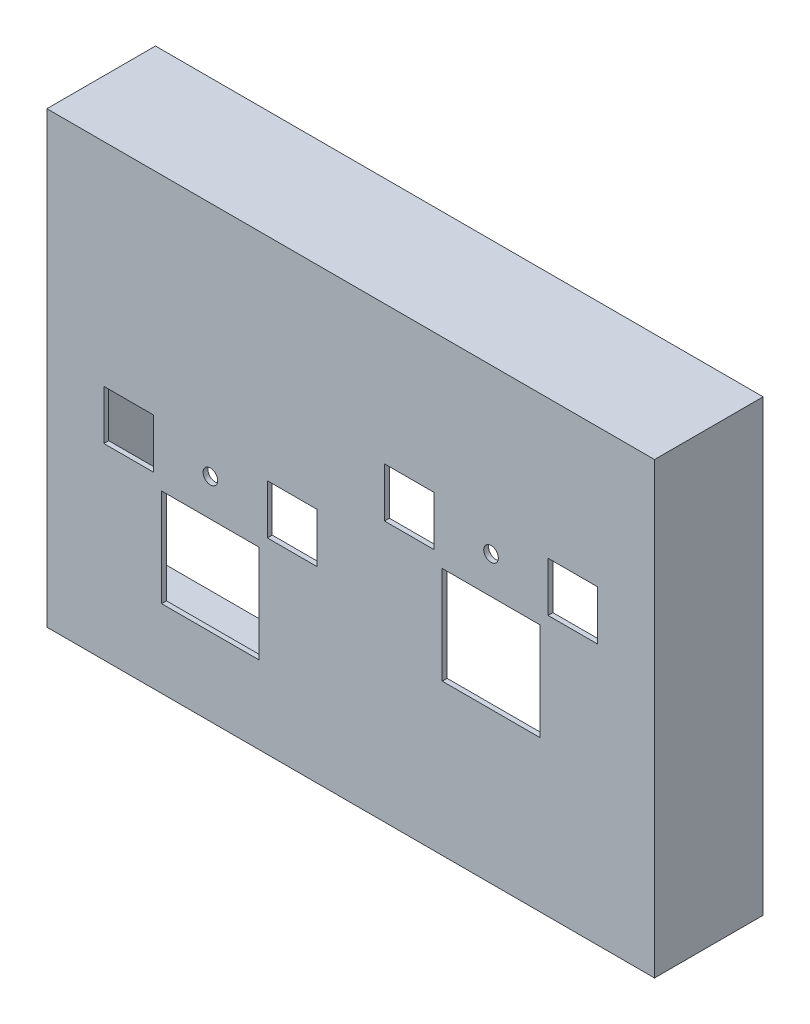
ISO-10303-21;
HEADER;
FILE_DESCRIPTION(('STEP AP214'),'2;1');
FILE_NAME('part.step','',(''),(''),'','','');
FILE_SCHEMA(('AUTOMOTIVE_DESIGN { 1 0 10303 214 1 1 1 1 }'));
ENDSEC;
DATA;
#1=APPLICATION_CONTEXT('core data for automotive mechanical design processes');
#2=APPLICATION_PROTOCOL_DEFINITION('international standard','automotive_design',2000,#1);
#3=PRODUCT_CONTEXT('',#1,'mechanical');
#4=PRODUCT('Part','Part','',(#3));
#5=PRODUCT_RELATED_PRODUCT_CATEGORY('part','',(#4));
#6=PRODUCT_DEFINITION_FORMATION('','',#4);
#7=PRODUCT_DEFINITION_CONTEXT('part definition',#1,'design');
#8=PRODUCT_DEFINITION('design','',#6,#7);
#9=PRODUCT_DEFINITION_SHAPE('','',#8);
#10=(LENGTH_UNIT() NAMED_UNIT(*) SI_UNIT(.MILLI.,.METRE.));
#11=(NAMED_UNIT(*) PLANE_ANGLE_UNIT() SI_UNIT($,.RADIAN.));
#12=(NAMED_UNIT(*) SI_UNIT($,.STERADIAN.) SOLID_ANGLE_UNIT());
#13=UNCERTAINTY_MEASURE_WITH_UNIT(LENGTH_MEASURE(1.E-05),#10,'distance_accuracy_value','');
#14=(GEOMETRIC_REPRESENTATION_CONTEXT(3) GLOBAL_UNCERTAINTY_ASSIGNED_CONTEXT((#13)) GLOBAL_UNIT_ASSIGNED_CONTEXT((#10,
#11,#12)) REPRESENTATION_CONTEXT('',''));
#15=CARTESIAN_POINT('',(0.,0.,0.));
#16=DIRECTION('',(0.,0.,1.));
#17=DIRECTION('',(1.,0.,0.));
#18=AXIS2_PLACEMENT_3D('',#15,#16,#17);
#19=CARTESIAN_POINT('',(0.,0.,0.));
#20=DIRECTION('',(0.,0.,-1.));
#21=DIRECTION('',(-1.,0.,0.));
#22=AXIS2_PLACEMENT_3D('',#19,#20,#21);
#23=PLANE('',#22);
#24=DIRECTION('',(-1.,0.,0.));
#25=VECTOR('',#24,1.);
#26=CARTESIAN_POINT('',(247.,-58.,0.));
#27=LINE('',#26,#25);
#28=CARTESIAN_POINT('',(247.,-58.,0.));
#29=VERTEX_POINT('',#28);
#30=CARTESIAN_POINT('',(2.00000000000001,-58.,0.));
#31=VERTEX_POINT('',#30);
#32=EDGE_CURVE('E290',#29,#31,#27,.T.);
#33=ORIENTED_EDGE('',*,*,#32,.F.);
#34=DIRECTION('',(0.,1.,0.));
#35=VECTOR('',#34,1.);
#36=CARTESIAN_POINT('',(247.,0.,0.));
#37=LINE('',#36,#35);
#38=CARTESIAN_POINT('',(247.,122.,0.));
#39=VERTEX_POINT('',#38);
#40=EDGE_CURVE('E509',#29,#39,#37,.T.);
#41=ORIENTED_EDGE('',*,*,#40,.T.);
#42=DIRECTION('',(1.,0.,0.));
#43=VECTOR('',#42,1.);
#44=CARTESIAN_POINT('',(2.,122.,0.));
#45=LINE('',#44,#43);
#46=CARTESIAN_POINT('',(2.,122.,0.));
#47=VERTEX_POINT('',#46);
#48=EDGE_CURVE('E325',#47,#39,#45,.T.);
#49=ORIENTED_EDGE('',*,*,#48,.F.);
#50=DIRECTION('',(0.,-1.,0.));
#51=VECTOR('',#50,1.);
#52=CARTESIAN_POINT('',(2.,0.,0.));
#53=LINE('',#52,#51);
#54=EDGE_CURVE('E505',#47,#31,#53,.T.);
#55=ORIENTED_EDGE('',*,*,#54,.T.);
#56=EDGE_LOOP('',(#33,#41,#49,#55));
#57=FACE_BOUND('',#56,.T.);
#58=DIRECTION('',(0.,-1.,0.));
#59=VECTOR('',#58,1.);
#60=CARTESIAN_POINT('',(0.,0.,0.));
#61=LINE('',#60,#59);
#62=CARTESIAN_POINT('',(0.,124.,0.));
#63=VERTEX_POINT('',#62);
#64=CARTESIAN_POINT('',(0.,-60.,0.));
#65=VERTEX_POINT('',#64);
#66=EDGE_CURVE('E511',#63,#65,#61,.T.);
#67=ORIENTED_EDGE('',*,*,#66,.F.);
#68=DIRECTION('',(-1.,0.,0.));
#69=VECTOR('',#68,1.);
#70=CARTESIAN_POINT('',(0.,124.,0.));
#71=LINE('',#70,#69);
#72=CARTESIAN_POINT('',(249.,124.,0.));
#73=VERTEX_POINT('',#72);
#74=EDGE_CURVE('E362',#73,#63,#71,.T.);
#75=ORIENTED_EDGE('',*,*,#74,.F.);
#76=DIRECTION('',(0.,1.,0.));
#77=VECTOR('',#76,1.);
#78=CARTESIAN_POINT('',(249.,0.,0.));
#79=LINE('',#78,#77);
#80=CARTESIAN_POINT('',(249.,-60.,0.));
#81=VERTEX_POINT('',#80);
#82=EDGE_CURVE('E514',#81,#73,#79,.T.);
#83=ORIENTED_EDGE('',*,*,#82,.F.);
#84=DIRECTION('',(1.,0.,0.));
#85=VECTOR('',#84,1.);
#86=CARTESIAN_POINT('',(0.,-60.,0.));
#87=LINE('',#86,#85);
#88=EDGE_CURVE('E349',#65,#81,#87,.T.);
#89=ORIENTED_EDGE('',*,*,#88,.F.);
#90=EDGE_LOOP('',(#67,#75,#83,#89));
#91=FACE_BOUND('',#90,.T.);
#92=ADVANCED_FACE('F43',(#57,#91),#23,.T.);
#93=CARTESIAN_POINT('',(0.,0.,44.5));
#94=DIRECTION('',(1.,0.,0.));
#95=DIRECTION('',(0.,0.,-1.));
#96=AXIS2_PLACEMENT_3D('',#93,#94,#95);
#97=PLANE('',#96);
#98=ORIENTED_EDGE('',*,*,#66,.T.);
#99=DIRECTION('',(0.,0.,1.));
#100=VECTOR('',#99,1.);
#101=CARTESIAN_POINT('',(0.,-60.,-256.126921661898));
#102=LINE('',#101,#100);
#103=CARTESIAN_POINT('',(0.,-60.,44.5));
#104=VERTEX_POINT('',#103);
#105=EDGE_CURVE('E355',#65,#104,#102,.T.);
#106=ORIENTED_EDGE('',*,*,#105,.T.);
#107=DIRECTION('',(0.,-1.,0.));
#108=VECTOR('',#107,1.);
#109=CARTESIAN_POINT('',(0.,0.,44.5));
#110=LINE('',#109,#108);
#111=CARTESIAN_POINT('',(0.,124.,44.5));
#112=VERTEX_POINT('',#111);
#113=EDGE_CURVE('E52',#112,#104,#110,.T.);
#114=ORIENTED_EDGE('',*,*,#113,.F.);
#115=DIRECTION('',(0.,0.,1.));
#116=VECTOR('',#115,1.);
#117=CARTESIAN_POINT('',(0.,124.,-256.126921661898));
#118=LINE('',#117,#116);
#119=EDGE_CURVE('E365',#63,#112,#118,.T.);
#120=ORIENTED_EDGE('',*,*,#119,.F.);
#121=EDGE_LOOP('',(#98,#106,#114,#120));
#122=FACE_BOUND('',#121,.T.);
#123=ADVANCED_FACE('F45',(#122),#97,.F.);
#124=CARTESIAN_POINT('',(249.,0.,44.5));
#125=DIRECTION('',(-1.,0.,0.));
#126=DIRECTION('',(0.,0.,1.));
#127=AXIS2_PLACEMENT_3D('',#124,#125,#126);
#128=PLANE('',#127);
#129=ORIENTED_EDGE('',*,*,#82,.T.);
#130=DIRECTION('',(0.,0.,1.));
#131=VECTOR('',#130,1.);
#132=CARTESIAN_POINT('',(249.,124.,-256.126921661898));
#133=LINE('',#132,#131);
#134=CARTESIAN_POINT('',(249.,124.,44.5));
#135=VERTEX_POINT('',#134);
#136=EDGE_CURVE('E361',#73,#135,#133,.T.);
#137=ORIENTED_EDGE('',*,*,#136,.T.);
#138=DIRECTION('',(0.,1.,0.));
#139=VECTOR('',#138,1.);
#140=CARTESIAN_POINT('',(249.,0.,44.5));
#141=LINE('',#140,#139);
#142=CARTESIAN_POINT('',(249.,-60.,44.5));
#143=VERTEX_POINT('',#142);
#144=EDGE_CURVE('E12',#143,#135,#141,.T.);
#145=ORIENTED_EDGE('',*,*,#144,.F.);
#146=DIRECTION('',(0.,0.,1.));
#147=VECTOR('',#146,1.);
#148=CARTESIAN_POINT('',(249.,-60.,-256.126921661898));
#149=LINE('',#148,#147);
#150=EDGE_CURVE('E352',#81,#143,#149,.T.);
#151=ORIENTED_EDGE('',*,*,#150,.F.);
#152=EDGE_LOOP('',(#129,#137,#145,#151));
#153=FACE_BOUND('',#152,.T.);
#154=ADVANCED_FACE('F577',(#153),#128,.F.);
#155=CARTESIAN_POINT('',(0.,0.,44.5));
#156=DIRECTION('',(0.,0.,-1.));
#157=DIRECTION('',(-1.,0.,0.));
#158=AXIS2_PLACEMENT_3D('',#155,#156,#157);
#159=PLANE('',#158);
#160=DIRECTION('',(1.,0.,0.));
#161=VECTOR('',#160,1.);
#162=CARTESIAN_POINT('',(47.,-28.15,44.5));
#163=LINE('',#162,#161);
#164=CARTESIAN_POINT('',(47.,-28.15,44.5));
#165=VERTEX_POINT('',#164);
#166=CARTESIAN_POINT('',(87.,-28.15,44.5));
#167=VERTEX_POINT('',#166);
#168=EDGE_CURVE('E283',#165,#167,#163,.T.);
#169=ORIENTED_EDGE('',*,*,#168,.F.);
#170=DIRECTION('',(0.,-1.,0.));
#171=VECTOR('',#170,1.);
#172=CARTESIAN_POINT('',(47.,11.85,44.5));
#173=LINE('',#172,#171);
#174=CARTESIAN_POINT('',(47.,11.85,44.5));
#175=VERTEX_POINT('',#174);
#176=EDGE_CURVE('E60',#175,#165,#173,.T.);
#177=ORIENTED_EDGE('',*,*,#176,.F.);
#178=DIRECTION('',(-1.,0.,0.));
#179=VECTOR('',#178,1.);
#180=CARTESIAN_POINT('',(47.,11.85,44.5));
#181=LINE('',#180,#179);
#182=CARTESIAN_POINT('',(87.,11.85,44.5));
#183=VERTEX_POINT('',#182);
#184=EDGE_CURVE('E274',#183,#175,#181,.T.);
#185=ORIENTED_EDGE('',*,*,#184,.F.);
#186=DIRECTION('',(0.,1.,0.));
#187=VECTOR('',#186,1.);
#188=CARTESIAN_POINT('',(87.,11.85,44.5));
#189=LINE('',#188,#187);
#190=EDGE_CURVE('E277',#167,#183,#189,.T.);
#191=ORIENTED_EDGE('',*,*,#190,.F.);
#192=EDGE_LOOP('',(#169,#177,#185,#191));
#193=FACE_BOUND('',#192,.T.);
#194=DIRECTION('',(1.,0.,0.));
#195=VECTOR('',#194,1.);
#196=CARTESIAN_POINT('',(162.,1.85,44.5));
#197=LINE('',#196,#195);
#198=CARTESIAN_POINT('',(162.,1.85,44.5));
#199=VERTEX_POINT('',#198);
#200=CARTESIAN_POINT('',(202.,1.85,44.5));
#201=VERTEX_POINT('',#200);
#202=EDGE_CURVE('E309',#199,#201,#197,.T.);
#203=ORIENTED_EDGE('',*,*,#202,.F.);
#204=DIRECTION('',(0.,-1.,0.));
#205=VECTOR('',#204,1.);
#206=CARTESIAN_POINT('',(162.,41.85,44.5));
#207=LINE('',#206,#205);
#208=CARTESIAN_POINT('',(162.,41.85,44.5));
#209=VERTEX_POINT('',#208);
#210=EDGE_CURVE('E68',#209,#199,#207,.T.);
#211=ORIENTED_EDGE('',*,*,#210,.F.);
#212=DIRECTION('',(-1.,0.,0.));
#213=VECTOR('',#212,1.);
#214=CARTESIAN_POINT('',(162.,41.85,44.5));
#215=LINE('',#214,#213);
#216=CARTESIAN_POINT('',(202.,41.85,44.5));
#217=VERTEX_POINT('',#216);
#218=EDGE_CURVE('E298',#217,#209,#215,.T.);
#219=ORIENTED_EDGE('',*,*,#218,.F.);
#220=DIRECTION('',(0.,1.,0.));
#221=VECTOR('',#220,1.);
#222=CARTESIAN_POINT('',(202.,41.85,44.5));
#223=LINE('',#222,#221);
#224=EDGE_CURVE('E312',#201,#217,#223,.T.);
#225=ORIENTED_EDGE('',*,*,#224,.F.);
#226=EDGE_LOOP('',(#203,#211,#219,#225));
#227=FACE_BOUND('',#226,.T.);
#228=CARTESIAN_POINT('',(67.,27.,44.5));
#229=DIRECTION('',(0.,0.,1.));
#230=DIRECTION('',(1.,0.,0.));
#231=AXIS2_PLACEMENT_3D('',#228,#229,#230);
#232=CIRCLE('',#231,3.00000000000001);
#233=CARTESIAN_POINT('',(70.,27.,44.5));
#234=VERTEX_POINT('',#233);
#235=EDGE_CURVE('E371',#234,#234,#232,.T.);
#236=ORIENTED_EDGE('',*,*,#235,.F.);
#237=EDGE_LOOP('',(#236));
#238=FACE_BOUND('',#237,.T.);
#239=CARTESIAN_POINT('',(182.,57.,44.5));
#240=DIRECTION('',(0.,0.,1.));
#241=DIRECTION('',(1.,0.,0.));
#242=AXIS2_PLACEMENT_3D('',#239,#240,#241);
#243=CIRCLE('',#242,2.99999999999999);
#244=CARTESIAN_POINT('',(185.,57.,44.5));
#245=VERTEX_POINT('',#244);
#246=EDGE_CURVE('E368',#245,#245,#243,.T.);
#247=ORIENTED_EDGE('',*,*,#246,.F.);
#248=EDGE_LOOP('',(#247));
#249=FACE_BOUND('',#248,.T.);
#250=DIRECTION('',(1.,0.,0.));
#251=VECTOR('',#250,1.);
#252=CARTESIAN_POINT('',(0.,37.15,44.5));
#253=LINE('',#252,#251);
#254=CARTESIAN_POINT('',(23.35,37.15,44.5));
#255=VERTEX_POINT('',#254);
#256=CARTESIAN_POINT('',(43.65,37.15,44.5));
#257=VERTEX_POINT('',#256);
#258=EDGE_CURVE('E499',#255,#257,#253,.T.);
#259=ORIENTED_EDGE('',*,*,#258,.T.);
#260=DIRECTION('',(0.,-1.,0.));
#261=VECTOR('',#260,1.);
#262=CARTESIAN_POINT('',(43.65,0.,44.5));
#263=LINE('',#262,#261);
#264=CARTESIAN_POINT('',(43.65,16.85,44.5));
#265=VERTEX_POINT('',#264);
#266=EDGE_CURVE('E502',#257,#265,#263,.T.);
#267=ORIENTED_EDGE('',*,*,#266,.T.);
#268=DIRECTION('',(-1.,0.,0.));
#269=VECTOR('',#268,1.);
#270=CARTESIAN_POINT('',(0.,16.85,44.5));
#271=LINE('',#270,#269);
#272=CARTESIAN_POINT('',(23.35,16.85,44.5));
#273=VERTEX_POINT('',#272);
#274=EDGE_CURVE('E493',#265,#273,#271,.T.);
#275=ORIENTED_EDGE('',*,*,#274,.T.);
#276=DIRECTION('',(0.,1.,0.));
#277=VECTOR('',#276,1.);
#278=CARTESIAN_POINT('',(23.35,0.,44.5));
#279=LINE('',#278,#277);
#280=EDGE_CURVE('E496',#273,#255,#279,.T.);
#281=ORIENTED_EDGE('',*,*,#280,.T.);
#282=EDGE_LOOP('',(#259,#267,#275,#281));
#283=FACE_BOUND('',#282,.T.);
#284=DIRECTION('',(1.,0.,0.));
#285=VECTOR('',#284,1.);
#286=CARTESIAN_POINT('',(0.,67.15,44.5));
#287=LINE('',#286,#285);
#288=CARTESIAN_POINT('',(205.35,67.15,44.5));
#289=VERTEX_POINT('',#288);
#290=CARTESIAN_POINT('',(225.65,67.15,44.5));
#291=VERTEX_POINT('',#290);
#292=EDGE_CURVE('E487',#289,#291,#287,.T.);
#293=ORIENTED_EDGE('',*,*,#292,.T.);
#294=DIRECTION('',(0.,-1.,0.));
#295=VECTOR('',#294,1.);
#296=CARTESIAN_POINT('',(225.65,0.,44.5));
#297=LINE('',#296,#295);
#298=CARTESIAN_POINT('',(225.65,46.85,44.5));
#299=VERTEX_POINT('',#298);
#300=EDGE_CURVE('E490',#291,#299,#297,.T.);
#301=ORIENTED_EDGE('',*,*,#300,.T.);
#302=DIRECTION('',(-1.,0.,0.));
#303=VECTOR('',#302,1.);
#304=CARTESIAN_POINT('',(0.,46.85,44.5));
#305=LINE('',#304,#303);
#306=CARTESIAN_POINT('',(205.35,46.85,44.5));
#307=VERTEX_POINT('',#306);
#308=EDGE_CURVE('E481',#299,#307,#305,.T.);
#309=ORIENTED_EDGE('',*,*,#308,.T.);
#310=DIRECTION('',(0.,1.,0.));
#311=VECTOR('',#310,1.);
#312=CARTESIAN_POINT('',(205.35,0.,44.5));
#313=LINE('',#312,#311);
#314=EDGE_CURVE('E484',#307,#289,#313,.T.);
#315=ORIENTED_EDGE('',*,*,#314,.T.);
#316=EDGE_LOOP('',(#293,#301,#309,#315));
#317=FACE_BOUND('',#316,.T.);
#318=DIRECTION('',(1.,0.,0.));
#319=VECTOR('',#318,1.);
#320=CARTESIAN_POINT('',(0.,67.15,44.5));
#321=LINE('',#320,#319);
#322=CARTESIAN_POINT('',(138.35,67.15,44.5));
#323=VERTEX_POINT('',#322);
#324=CARTESIAN_POINT('',(158.65,67.15,44.5));
#325=VERTEX_POINT('',#324);
#326=EDGE_CURVE('E475',#323,#325,#321,.T.);
#327=ORIENTED_EDGE('',*,*,#326,.T.);
#328=DIRECTION('',(0.,-1.,0.));
#329=VECTOR('',#328,1.);
#330=CARTESIAN_POINT('',(158.65,2.16917343419681E-13,44.5));
#331=LINE('',#330,#329);
#332=CARTESIAN_POINT('',(158.65,46.85,44.5));
#333=VERTEX_POINT('',#332);
#334=EDGE_CURVE('E478',#325,#333,#331,.T.);
#335=ORIENTED_EDGE('',*,*,#334,.T.);
#336=DIRECTION('',(-1.,0.,0.));
#337=VECTOR('',#336,1.);
#338=CARTESIAN_POINT('',(0.,46.8499999999999,44.5));
#339=LINE('',#338,#337);
#340=CARTESIAN_POINT('',(138.35,46.85,44.5));
#341=VERTEX_POINT('',#340);
#342=EDGE_CURVE('E469',#333,#341,#339,.T.);
#343=ORIENTED_EDGE('',*,*,#342,.T.);
#344=DIRECTION('',(0.,1.,0.));
#345=VECTOR('',#344,1.);
#346=CARTESIAN_POINT('',(138.35,0.,44.5));
#347=LINE('',#346,#345);
#348=EDGE_CURVE('E472',#341,#323,#347,.T.);
#349=ORIENTED_EDGE('',*,*,#348,.T.);
#350=EDGE_LOOP('',(#327,#335,#343,#349));
#351=FACE_BOUND('',#350,.T.);
#352=DIRECTION('',(1.,0.,0.));
#353=VECTOR('',#352,1.);
#354=CARTESIAN_POINT('',(0.,37.15,44.5));
#355=LINE('',#354,#353);
#356=CARTESIAN_POINT('',(90.35,37.15,44.5));
#357=VERTEX_POINT('',#356);
#358=CARTESIAN_POINT('',(110.65,37.15,44.5));
#359=VERTEX_POINT('',#358);
#360=EDGE_CURVE('E463',#357,#359,#355,.T.);
#361=ORIENTED_EDGE('',*,*,#360,.T.);
#362=DIRECTION('',(0.,-1.,0.));
#363=VECTOR('',#362,1.);
#364=CARTESIAN_POINT('',(110.65,0.,44.5));
#365=LINE('',#364,#363);
#366=CARTESIAN_POINT('',(110.65,16.85,44.5));
#367=VERTEX_POINT('',#366);
#368=EDGE_CURVE('E466',#359,#367,#365,.T.);
#369=ORIENTED_EDGE('',*,*,#368,.T.);
#370=DIRECTION('',(-1.,0.,0.));
#371=VECTOR('',#370,1.);
#372=CARTESIAN_POINT('',(0.,16.85,44.5));
#373=LINE('',#372,#371);
#374=CARTESIAN_POINT('',(90.35,16.85,44.5));
#375=VERTEX_POINT('',#374);
#376=EDGE_CURVE('E451',#367,#375,#373,.T.);
#377=ORIENTED_EDGE('',*,*,#376,.T.);
#378=DIRECTION('',(0.,1.,0.));
#379=VECTOR('',#378,1.);
#380=CARTESIAN_POINT('',(90.35,0.,44.5));
#381=LINE('',#380,#379);
#382=EDGE_CURVE('E460',#375,#357,#381,.T.);
#383=ORIENTED_EDGE('',*,*,#382,.T.);
#384=EDGE_LOOP('',(#361,#369,#377,#383));
#385=FACE_BOUND('',#384,.T.);
#386=ORIENTED_EDGE('',*,*,#113,.T.);
#387=DIRECTION('',(1.,0.,0.));
#388=VECTOR('',#387,1.);
#389=CARTESIAN_POINT('',(0.,-60.,44.5));
#390=LINE('',#389,#388);
#391=EDGE_CURVE('E344',#104,#143,#390,.T.);
#392=ORIENTED_EDGE('',*,*,#391,.T.);
#393=ORIENTED_EDGE('',*,*,#144,.T.);
#394=DIRECTION('',(-1.,0.,0.));
#395=VECTOR('',#394,1.);
#396=CARTESIAN_POINT('',(0.,124.,44.5));
#397=LINE('',#396,#395);
#398=EDGE_CURVE('E358',#135,#112,#397,.T.);
#399=ORIENTED_EDGE('',*,*,#398,.T.);
#400=EDGE_LOOP('',(#386,#392,#393,#399));
#401=FACE_BOUND('',#400,.T.);
#402=ADVANCED_FACE('F583',(#193,#227,#238,#249,#283,#317,#351,#385,#401),#159,.F.);
#403=CARTESIAN_POINT('',(2.,0.,44.5));
#404=DIRECTION('',(1.,0.,0.));
#405=DIRECTION('',(0.,0.,-1.));
#406=AXIS2_PLACEMENT_3D('',#403,#404,#405);
#407=PLANE('',#406);
#408=DIRECTION('',(0.,0.,-1.));
#409=VECTOR('',#408,1.);
#410=CARTESIAN_POINT('',(2.00000000000001,-58.,42.5));
#411=LINE('',#410,#409);
#412=CARTESIAN_POINT('',(2.00000000000001,-58.,42.5));
#413=VERTEX_POINT('',#412);
#414=EDGE_CURVE('E333',#413,#31,#411,.T.);
#415=ORIENTED_EDGE('',*,*,#414,.T.);
#416=ORIENTED_EDGE('',*,*,#54,.F.);
#417=DIRECTION('',(0.,0.,-1.));
#418=VECTOR('',#417,1.);
#419=CARTESIAN_POINT('',(2.00000000000001,122.,42.5));
#420=LINE('',#419,#418);
#421=CARTESIAN_POINT('',(2.00000000000001,122.,42.5));
#422=VERTEX_POINT('',#421);
#423=EDGE_CURVE('E332',#422,#47,#420,.T.);
#424=ORIENTED_EDGE('',*,*,#423,.F.);
#425=DIRECTION('',(0.,-1.,0.));
#426=VECTOR('',#425,1.);
#427=CARTESIAN_POINT('',(2.,0.,42.5));
#428=LINE('',#427,#426);
#429=EDGE_CURVE('E506',#422,#413,#428,.T.);
#430=ORIENTED_EDGE('',*,*,#429,.T.);
#431=EDGE_LOOP('',(#415,#416,#424,#430));
#432=FACE_BOUND('',#431,.T.);
#433=ADVANCED_FACE('F553',(#432),#407,.T.);
#434=CARTESIAN_POINT('',(247.,0.,44.5));
#435=DIRECTION('',(-1.,0.,0.));
#436=DIRECTION('',(0.,0.,1.));
#437=AXIS2_PLACEMENT_3D('',#434,#435,#436);
#438=PLANE('',#437);
#439=ORIENTED_EDGE('',*,*,#40,.F.);
#440=DIRECTION('',(0.,0.,1.));
#441=VECTOR('',#440,1.);
#442=CARTESIAN_POINT('',(247.,-58.,2.));
#443=LINE('',#442,#441);
#444=CARTESIAN_POINT('',(247.,-58.,42.5));
#445=VERTEX_POINT('',#444);
#446=EDGE_CURVE('E329',#29,#445,#443,.T.);
#447=ORIENTED_EDGE('',*,*,#446,.T.);
#448=DIRECTION('',(0.,1.,0.));
#449=VECTOR('',#448,1.);
#450=CARTESIAN_POINT('',(247.,0.,42.5));
#451=LINE('',#450,#449);
#452=CARTESIAN_POINT('',(247.,122.,42.5));
#453=VERTEX_POINT('',#452);
#454=EDGE_CURVE('E508',#445,#453,#451,.T.);
#455=ORIENTED_EDGE('',*,*,#454,.T.);
#456=DIRECTION('',(0.,0.,1.));
#457=VECTOR('',#456,1.);
#458=CARTESIAN_POINT('',(247.,122.,2.));
#459=LINE('',#458,#457);
#460=EDGE_CURVE('E340',#39,#453,#459,.T.);
#461=ORIENTED_EDGE('',*,*,#460,.F.);
#462=EDGE_LOOP('',(#439,#447,#455,#461));
#463=FACE_BOUND('',#462,.T.);
#464=ADVANCED_FACE('F529',(#463),#438,.T.);
#465=CARTESIAN_POINT('',(0.,0.,42.5));
#466=DIRECTION('',(0.,0.,-1.));
#467=DIRECTION('',(-1.,0.,0.));
#468=AXIS2_PLACEMENT_3D('',#465,#466,#467);
#469=PLANE('',#468);
#470=DIRECTION('',(0.,-1.,0.));
#471=VECTOR('',#470,1.);
#472=CARTESIAN_POINT('',(47.,11.85,42.5));
#473=LINE('',#472,#471);
#474=CARTESIAN_POINT('',(47.,11.85,42.5));
#475=VERTEX_POINT('',#474);
#476=CARTESIAN_POINT('',(47.,-28.15,42.5));
#477=VERTEX_POINT('',#476);
#478=EDGE_CURVE('E255',#475,#477,#473,.T.);
#479=ORIENTED_EDGE('',*,*,#478,.T.);
#480=DIRECTION('',(1.,0.,0.));
#481=VECTOR('',#480,1.);
#482=CARTESIAN_POINT('',(47.,-28.15,42.5));
#483=LINE('',#482,#481);
#484=CARTESIAN_POINT('',(87.,-28.15,42.5));
#485=VERTEX_POINT('',#484);
#486=EDGE_CURVE('E265',#477,#485,#483,.T.);
#487=ORIENTED_EDGE('',*,*,#486,.T.);
#488=DIRECTION('',(0.,1.,0.));
#489=VECTOR('',#488,1.);
#490=CARTESIAN_POINT('',(87.,11.85,42.5));
#491=LINE('',#490,#489);
#492=CARTESIAN_POINT('',(87.,11.85,42.5));
#493=VERTEX_POINT('',#492);
#494=EDGE_CURVE('E269',#485,#493,#491,.T.);
#495=ORIENTED_EDGE('',*,*,#494,.T.);
#496=DIRECTION('',(-1.,0.,0.));
#497=VECTOR('',#496,1.);
#498=CARTESIAN_POINT('',(47.,11.85,42.5));
#499=LINE('',#498,#497);
#500=EDGE_CURVE('E261',#493,#475,#499,.T.);
#501=ORIENTED_EDGE('',*,*,#500,.T.);
#502=EDGE_LOOP('',(#479,#487,#495,#501));
#503=FACE_BOUND('',#502,.T.);
#504=DIRECTION('',(0.,-1.,0.));
#505=VECTOR('',#504,1.);
#506=CARTESIAN_POINT('',(162.,41.85,42.5));
#507=LINE('',#506,#505);
#508=CARTESIAN_POINT('',(162.,41.85,42.5));
#509=VERTEX_POINT('',#508);
#510=CARTESIAN_POINT('',(162.,1.85,42.5));
#511=VERTEX_POINT('',#510);
#512=EDGE_CURVE('E294',#509,#511,#507,.T.);
#513=ORIENTED_EDGE('',*,*,#512,.T.);
#514=DIRECTION('',(1.,0.,0.));
#515=VECTOR('',#514,1.);
#516=CARTESIAN_POINT('',(162.,1.85,42.5));
#517=LINE('',#516,#515);
#518=CARTESIAN_POINT('',(202.,1.85,42.5));
#519=VERTEX_POINT('',#518);
#520=EDGE_CURVE('E297',#511,#519,#517,.T.);
#521=ORIENTED_EDGE('',*,*,#520,.T.);
#522=DIRECTION('',(0.,1.,0.));
#523=VECTOR('',#522,1.);
#524=CARTESIAN_POINT('',(202.,41.85,42.5));
#525=LINE('',#524,#523);
#526=CARTESIAN_POINT('',(202.,41.85,42.5));
#527=VERTEX_POINT('',#526);
#528=EDGE_CURVE('E301',#519,#527,#525,.T.);
#529=ORIENTED_EDGE('',*,*,#528,.T.);
#530=DIRECTION('',(-1.,0.,0.));
#531=VECTOR('',#530,1.);
#532=CARTESIAN_POINT('',(162.,41.85,42.5));
#533=LINE('',#532,#531);
#534=EDGE_CURVE('E304',#527,#509,#533,.T.);
#535=ORIENTED_EDGE('',*,*,#534,.T.);
#536=EDGE_LOOP('',(#513,#521,#529,#535));
#537=FACE_BOUND('',#536,.T.);
#538=CARTESIAN_POINT('',(67.,27.,42.5));
#539=DIRECTION('',(0.,0.,-1.));
#540=DIRECTION('',(-1.,0.,0.));
#541=AXIS2_PLACEMENT_3D('',#538,#539,#540);
#542=CIRCLE('',#541,3.00000000000001);
#543=CARTESIAN_POINT('',(64.,27.,42.5));
#544=VERTEX_POINT('',#543);
#545=EDGE_CURVE('E47',#544,#544,#542,.T.);
#546=ORIENTED_EDGE('',*,*,#545,.F.);
#547=EDGE_LOOP('',(#546));
#548=FACE_BOUND('',#547,.T.);
#549=CARTESIAN_POINT('',(182.,57.,42.5));
#550=DIRECTION('',(0.,0.,-1.));
#551=DIRECTION('',(-1.,0.,0.));
#552=AXIS2_PLACEMENT_3D('',#549,#550,#551);
#553=CIRCLE('',#552,2.99999999999999);
#554=CARTESIAN_POINT('',(179.,57.,42.5));
#555=VERTEX_POINT('',#554);
#556=EDGE_CURVE('E374',#555,#555,#553,.T.);
#557=ORIENTED_EDGE('',*,*,#556,.F.);
#558=EDGE_LOOP('',(#557));
#559=FACE_BOUND('',#558,.T.);
#560=DIRECTION('',(0.,-1.,0.));
#561=VECTOR('',#560,1.);
#562=CARTESIAN_POINT('',(43.65,37.15,42.5));
#563=LINE('',#562,#561);
#564=CARTESIAN_POINT('',(43.65,37.15,42.5));
#565=VERTEX_POINT('',#564);
#566=CARTESIAN_POINT('',(43.65,16.85,42.5));
#567=VERTEX_POINT('',#566);
#568=EDGE_CURVE('E398',#565,#567,#563,.T.);
#569=ORIENTED_EDGE('',*,*,#568,.F.);
#570=DIRECTION('',(1.,0.,0.));
#571=VECTOR('',#570,1.);
#572=CARTESIAN_POINT('',(43.65,37.15,42.5));
#573=LINE('',#572,#571);
#574=CARTESIAN_POINT('',(23.35,37.15,42.5));
#575=VERTEX_POINT('',#574);
#576=EDGE_CURVE('E407',#575,#565,#573,.T.);
#577=ORIENTED_EDGE('',*,*,#576,.F.);
#578=DIRECTION('',(0.,1.,0.));
#579=VECTOR('',#578,1.);
#580=CARTESIAN_POINT('',(23.35,37.15,42.5));
#581=LINE('',#580,#579);
#582=CARTESIAN_POINT('',(23.35,16.85,42.5));
#583=VERTEX_POINT('',#582);
#584=EDGE_CURVE('E404',#583,#575,#581,.T.);
#585=ORIENTED_EDGE('',*,*,#584,.F.);
#586=DIRECTION('',(-1.,0.,0.));
#587=VECTOR('',#586,1.);
#588=CARTESIAN_POINT('',(43.65,16.85,42.5));
#589=LINE('',#588,#587);
#590=EDGE_CURVE('E400',#567,#583,#589,.T.);
#591=ORIENTED_EDGE('',*,*,#590,.F.);
#592=EDGE_LOOP('',(#569,#577,#585,#591));
#593=FACE_BOUND('',#592,.T.);
#594=DIRECTION('',(0.,-1.,0.));
#595=VECTOR('',#594,1.);
#596=CARTESIAN_POINT('',(225.65,67.15,42.5));
#597=LINE('',#596,#595);
#598=CARTESIAN_POINT('',(225.65,67.15,42.5));
#599=VERTEX_POINT('',#598);
#600=CARTESIAN_POINT('',(225.65,46.85,42.5));
#601=VERTEX_POINT('',#600);
#602=EDGE_CURVE('E391',#599,#601,#597,.T.);
#603=ORIENTED_EDGE('',*,*,#602,.F.);
#604=DIRECTION('',(1.,0.,0.));
#605=VECTOR('',#604,1.);
#606=CARTESIAN_POINT('',(225.65,67.15,42.5));
#607=LINE('',#606,#605);
#608=CARTESIAN_POINT('',(205.35,67.15,42.5));
#609=VERTEX_POINT('',#608);
#610=EDGE_CURVE('E427',#609,#599,#607,.T.);
#611=ORIENTED_EDGE('',*,*,#610,.F.);
#612=DIRECTION('',(0.,1.,0.));
#613=VECTOR('',#612,1.);
#614=CARTESIAN_POINT('',(205.35,67.15,42.5));
#615=LINE('',#614,#613);
#616=CARTESIAN_POINT('',(205.35,46.85,42.5));
#617=VERTEX_POINT('',#616);
#618=EDGE_CURVE('E424',#617,#609,#615,.T.);
#619=ORIENTED_EDGE('',*,*,#618,.F.);
#620=DIRECTION('',(-1.,0.,0.));
#621=VECTOR('',#620,1.);
#622=CARTESIAN_POINT('',(225.65,46.85,42.5));
#623=LINE('',#622,#621);
#624=EDGE_CURVE('E421',#601,#617,#623,.T.);
#625=ORIENTED_EDGE('',*,*,#624,.F.);
#626=EDGE_LOOP('',(#603,#611,#619,#625));
#627=FACE_BOUND('',#626,.T.);
#628=DIRECTION('',(0.,-1.,0.));
#629=VECTOR('',#628,1.);
#630=CARTESIAN_POINT('',(158.65,67.15,42.5));
#631=LINE('',#630,#629);
#632=CARTESIAN_POINT('',(158.65,67.15,42.5));
#633=VERTEX_POINT('',#632);
#634=CARTESIAN_POINT('',(158.65,46.85,42.5));
#635=VERTEX_POINT('',#634);
#636=EDGE_CURVE('E377',#633,#635,#631,.T.);
#637=ORIENTED_EDGE('',*,*,#636,.F.);
#638=DIRECTION('',(1.,0.,0.));
#639=VECTOR('',#638,1.);
#640=CARTESIAN_POINT('',(158.65,67.15,42.5));
#641=LINE('',#640,#639);
#642=CARTESIAN_POINT('',(138.35,67.15,42.5));
#643=VERTEX_POINT('',#642);
#644=EDGE_CURVE('E385',#643,#633,#641,.T.);
#645=ORIENTED_EDGE('',*,*,#644,.F.);
#646=DIRECTION('',(0.,1.,0.));
#647=VECTOR('',#646,1.);
#648=CARTESIAN_POINT('',(138.35,67.15,42.5));
#649=LINE('',#648,#647);
#650=CARTESIAN_POINT('',(138.35,46.85,42.5));
#651=VERTEX_POINT('',#650);
#652=EDGE_CURVE('E382',#651,#643,#649,.T.);
#653=ORIENTED_EDGE('',*,*,#652,.F.);
#654=DIRECTION('',(-1.,0.,0.));
#655=VECTOR('',#654,1.);
#656=CARTESIAN_POINT('',(158.65,46.85,42.5));
#657=LINE('',#656,#655);
#658=EDGE_CURVE('E379',#635,#651,#657,.T.);
#659=ORIENTED_EDGE('',*,*,#658,.F.);
#660=EDGE_LOOP('',(#637,#645,#653,#659));
#661=FACE_BOUND('',#660,.T.);
#662=DIRECTION('',(0.,-1.,0.));
#663=VECTOR('',#662,1.);
#664=CARTESIAN_POINT('',(110.65,37.15,42.5));
#665=LINE('',#664,#663);
#666=CARTESIAN_POINT('',(110.65,37.15,42.5));
#667=VERTEX_POINT('',#666);
#668=CARTESIAN_POINT('',(110.65,16.85,42.5));
#669=VERTEX_POINT('',#668);
#670=EDGE_CURVE('E413',#667,#669,#665,.T.);
#671=ORIENTED_EDGE('',*,*,#670,.F.);
#672=DIRECTION('',(1.,0.,0.));
#673=VECTOR('',#672,1.);
#674=CARTESIAN_POINT('',(110.65,37.15,42.5));
#675=LINE('',#674,#673);
#676=CARTESIAN_POINT('',(90.35,37.15,42.5));
#677=VERTEX_POINT('',#676);
#678=EDGE_CURVE('E445',#677,#667,#675,.T.);
#679=ORIENTED_EDGE('',*,*,#678,.F.);
#680=DIRECTION('',(0.,1.,0.));
#681=VECTOR('',#680,1.);
#682=CARTESIAN_POINT('',(90.35,37.15,42.5));
#683=LINE('',#682,#681);
#684=CARTESIAN_POINT('',(90.35,16.85,42.5));
#685=VERTEX_POINT('',#684);
#686=EDGE_CURVE('E442',#685,#677,#683,.T.);
#687=ORIENTED_EDGE('',*,*,#686,.F.);
#688=DIRECTION('',(-1.,0.,0.));
#689=VECTOR('',#688,1.);
#690=CARTESIAN_POINT('',(110.65,16.85,42.5));
#691=LINE('',#690,#689);
#692=EDGE_CURVE('E439',#669,#685,#691,.T.);
#693=ORIENTED_EDGE('',*,*,#692,.F.);
#694=EDGE_LOOP('',(#671,#679,#687,#693));
#695=FACE_BOUND('',#694,.T.);
#696=ORIENTED_EDGE('',*,*,#429,.F.);
#697=DIRECTION('',(-1.,0.,0.));
#698=VECTOR('',#697,1.);
#699=CARTESIAN_POINT('',(247.,122.,42.5));
#700=LINE('',#699,#698);
#701=EDGE_CURVE('E341',#453,#422,#700,.T.);
#702=ORIENTED_EDGE('',*,*,#701,.F.);
#703=ORIENTED_EDGE('',*,*,#454,.F.);
#704=DIRECTION('',(-1.,0.,0.));
#705=VECTOR('',#704,1.);
#706=CARTESIAN_POINT('',(247.,-58.,42.5));
#707=LINE('',#706,#705);
#708=EDGE_CURVE('E328',#445,#413,#707,.T.);
#709=ORIENTED_EDGE('',*,*,#708,.T.);
#710=EDGE_LOOP('',(#696,#702,#703,#709));
#711=FACE_BOUND('',#710,.T.);
#712=ADVANCED_FACE('F271',(#503,#537,#548,#559,#593,#627,#661,#695,#711),#469,.T.);
#713=CARTESIAN_POINT('',(110.65,37.15,87.5));
#714=DIRECTION('',(1.,0.,0.));
#715=DIRECTION('',(0.,0.,-1.));
#716=AXIS2_PLACEMENT_3D('',#713,#714,#715);
#717=PLANE('',#716);
#718=DIRECTION('',(0.,0.,-1.));
#719=VECTOR('',#718,1.);
#720=CARTESIAN_POINT('',(110.65,37.15,87.5));
#721=LINE('',#720,#719);
#722=EDGE_CURVE('E449',#359,#667,#721,.T.);
#723=ORIENTED_EDGE('',*,*,#722,.T.);
#724=ORIENTED_EDGE('',*,*,#670,.T.);
#725=DIRECTION('',(0.,0.,-1.));
#726=VECTOR('',#725,1.);
#727=CARTESIAN_POINT('',(110.65,16.85,87.5));
#728=LINE('',#727,#726);
#729=EDGE_CURVE('E448',#367,#669,#728,.T.);
#730=ORIENTED_EDGE('',*,*,#729,.F.);
#731=ORIENTED_EDGE('',*,*,#368,.F.);
#732=EDGE_LOOP('',(#723,#724,#730,#731));
#733=FACE_BOUND('',#732,.T.);
#734=ADVANCED_FACE('F528',(#733),#717,.F.);
#735=CARTESIAN_POINT('',(110.65,37.15,87.5));
#736=DIRECTION('',(0.,1.,0.));
#737=DIRECTION('',(-1.,0.,0.));
#738=AXIS2_PLACEMENT_3D('',#735,#736,#737);
#739=PLANE('',#738);
#740=DIRECTION('',(0.,0.,-1.));
#741=VECTOR('',#740,1.);
#742=CARTESIAN_POINT('',(90.35,37.15,87.5));
#743=LINE('',#742,#741);
#744=EDGE_CURVE('E452',#357,#677,#743,.T.);
#745=ORIENTED_EDGE('',*,*,#744,.T.);
#746=ORIENTED_EDGE('',*,*,#678,.T.);
#747=ORIENTED_EDGE('',*,*,#722,.F.);
#748=ORIENTED_EDGE('',*,*,#360,.F.);
#749=EDGE_LOOP('',(#745,#746,#747,#748));
#750=FACE_BOUND('',#749,.T.);
#751=ADVANCED_FACE('F599',(#750),#739,.F.);
#752=CARTESIAN_POINT('',(90.35,37.15,87.5));
#753=DIRECTION('',(-1.,0.,0.));
#754=DIRECTION('',(0.,0.,1.));
#755=AXIS2_PLACEMENT_3D('',#752,#753,#754);
#756=PLANE('',#755);
#757=DIRECTION('',(0.,0.,-1.));
#758=VECTOR('',#757,1.);
#759=CARTESIAN_POINT('',(90.35,16.85,87.5));
#760=LINE('',#759,#758);
#761=EDGE_CURVE('E454',#375,#685,#760,.T.);
#762=ORIENTED_EDGE('',*,*,#761,.T.);
#763=ORIENTED_EDGE('',*,*,#686,.T.);
#764=ORIENTED_EDGE('',*,*,#744,.F.);
#765=ORIENTED_EDGE('',*,*,#382,.F.);
#766=EDGE_LOOP('',(#762,#763,#764,#765));
#767=FACE_BOUND('',#766,.T.);
#768=ADVANCED_FACE('F605',(#767),#756,.F.);
#769=CARTESIAN_POINT('',(110.65,16.85,87.5));
#770=DIRECTION('',(0.,-1.,0.));
#771=DIRECTION('',(0.,0.,-1.));
#772=AXIS2_PLACEMENT_3D('',#769,#770,#771);
#773=PLANE('',#772);
#774=ORIENTED_EDGE('',*,*,#729,.T.);
#775=ORIENTED_EDGE('',*,*,#692,.T.);
#776=ORIENTED_EDGE('',*,*,#761,.F.);
#777=ORIENTED_EDGE('',*,*,#376,.F.);
#778=EDGE_LOOP('',(#774,#775,#776,#777));
#779=FACE_BOUND('',#778,.T.);
#780=ADVANCED_FACE('F601',(#779),#773,.F.);
#781=CARTESIAN_POINT('',(158.65,67.15,87.5));
#782=DIRECTION('',(1.,0.,0.));
#783=DIRECTION('',(0.,1.,0.));
#784=AXIS2_PLACEMENT_3D('',#781,#782,#783);
#785=PLANE('',#784);
#786=DIRECTION('',(0.,0.,-1.));
#787=VECTOR('',#786,1.);
#788=CARTESIAN_POINT('',(158.65,67.15,87.5));
#789=LINE('',#788,#787);
#790=EDGE_CURVE('E389',#325,#633,#789,.T.);
#791=ORIENTED_EDGE('',*,*,#790,.T.);
#792=ORIENTED_EDGE('',*,*,#636,.T.);
#793=DIRECTION('',(0.,0.,-1.));
#794=VECTOR('',#793,1.);
#795=CARTESIAN_POINT('',(158.65,46.85,87.5));
#796=LINE('',#795,#794);
#797=EDGE_CURVE('E388',#333,#635,#796,.T.);
#798=ORIENTED_EDGE('',*,*,#797,.F.);
#799=ORIENTED_EDGE('',*,*,#334,.F.);
#800=EDGE_LOOP('',(#791,#792,#798,#799));
#801=FACE_BOUND('',#800,.T.);
#802=ADVANCED_FACE('F604',(#801),#785,.F.);
#803=CARTESIAN_POINT('',(158.65,67.15,87.5));
#804=DIRECTION('',(0.,1.,0.));
#805=DIRECTION('',(0.,0.,1.));
#806=AXIS2_PLACEMENT_3D('',#803,#804,#805);
#807=PLANE('',#806);
#808=DIRECTION('',(0.,0.,-1.));
#809=VECTOR('',#808,1.);
#810=CARTESIAN_POINT('',(138.35,67.15,87.5));
#811=LINE('',#810,#809);
#812=EDGE_CURVE('E392',#323,#643,#811,.T.);
#813=ORIENTED_EDGE('',*,*,#812,.T.);
#814=ORIENTED_EDGE('',*,*,#644,.T.);
#815=ORIENTED_EDGE('',*,*,#790,.F.);
#816=ORIENTED_EDGE('',*,*,#326,.F.);
#817=EDGE_LOOP('',(#813,#814,#815,#816));
#818=FACE_BOUND('',#817,.T.);
#819=ADVANCED_FACE('F649',(#818),#807,.F.);
#820=CARTESIAN_POINT('',(138.35,67.15,87.5));
#821=DIRECTION('',(-1.,0.,0.));
#822=DIRECTION('',(0.,0.,1.));
#823=AXIS2_PLACEMENT_3D('',#820,#821,#822);
#824=PLANE('',#823);
#825=DIRECTION('',(0.,0.,-1.));
#826=VECTOR('',#825,1.);
#827=CARTESIAN_POINT('',(138.35,46.85,87.5));
#828=LINE('',#827,#826);
#829=EDGE_CURVE('E394',#341,#651,#828,.T.);
#830=ORIENTED_EDGE('',*,*,#829,.T.);
#831=ORIENTED_EDGE('',*,*,#652,.T.);
#832=ORIENTED_EDGE('',*,*,#812,.F.);
#833=ORIENTED_EDGE('',*,*,#348,.F.);
#834=EDGE_LOOP('',(#830,#831,#832,#833));
#835=FACE_BOUND('',#834,.T.);
#836=ADVANCED_FACE('F653',(#835),#824,.F.);
#837=CARTESIAN_POINT('',(158.65,46.85,87.5));
#838=DIRECTION('',(0.,-1.,0.));
#839=DIRECTION('',(1.,0.,0.));
#840=AXIS2_PLACEMENT_3D('',#837,#838,#839);
#841=PLANE('',#840);
#842=ORIENTED_EDGE('',*,*,#797,.T.);
#843=ORIENTED_EDGE('',*,*,#658,.T.);
#844=ORIENTED_EDGE('',*,*,#829,.F.);
#845=ORIENTED_EDGE('',*,*,#342,.F.);
#846=EDGE_LOOP('',(#842,#843,#844,#845));
#847=FACE_BOUND('',#846,.T.);
#848=ADVANCED_FACE('F617',(#847),#841,.F.);
#849=CARTESIAN_POINT('',(225.65,67.15,87.5));
#850=DIRECTION('',(1.,0.,0.));
#851=DIRECTION('',(0.,0.,-1.));
#852=AXIS2_PLACEMENT_3D('',#849,#850,#851);
#853=PLANE('',#852);
#854=DIRECTION('',(0.,0.,-1.));
#855=VECTOR('',#854,1.);
#856=CARTESIAN_POINT('',(225.65,67.15,87.5));
#857=LINE('',#856,#855);
#858=EDGE_CURVE('E401',#291,#599,#857,.T.);
#859=ORIENTED_EDGE('',*,*,#858,.T.);
#860=ORIENTED_EDGE('',*,*,#602,.T.);
#861=DIRECTION('',(0.,0.,-1.));
#862=VECTOR('',#861,1.);
#863=CARTESIAN_POINT('',(225.65,46.85,87.5));
#864=LINE('',#863,#862);
#865=EDGE_CURVE('E430',#299,#601,#864,.T.);
#866=ORIENTED_EDGE('',*,*,#865,.F.);
#867=ORIENTED_EDGE('',*,*,#300,.F.);
#868=EDGE_LOOP('',(#859,#860,#866,#867));
#869=FACE_BOUND('',#868,.T.);
#870=ADVANCED_FACE('F613',(#869),#853,.F.);
#871=CARTESIAN_POINT('',(225.65,67.15,87.5));
#872=DIRECTION('',(0.,1.,0.));
#873=DIRECTION('',(0.,0.,1.));
#874=AXIS2_PLACEMENT_3D('',#871,#872,#873);
#875=PLANE('',#874);
#876=DIRECTION('',(0.,0.,-1.));
#877=VECTOR('',#876,1.);
#878=CARTESIAN_POINT('',(205.35,67.15,87.5));
#879=LINE('',#878,#877);
#880=EDGE_CURVE('E432',#289,#609,#879,.T.);
#881=ORIENTED_EDGE('',*,*,#880,.T.);
#882=ORIENTED_EDGE('',*,*,#610,.T.);
#883=ORIENTED_EDGE('',*,*,#858,.F.);
#884=ORIENTED_EDGE('',*,*,#292,.F.);
#885=EDGE_LOOP('',(#881,#882,#883,#884));
#886=FACE_BOUND('',#885,.T.);
#887=ADVANCED_FACE('F616',(#886),#875,.F.);
#888=CARTESIAN_POINT('',(205.35,67.15,87.5));
#889=DIRECTION('',(-1.,0.,0.));
#890=DIRECTION('',(0.,0.,1.));
#891=AXIS2_PLACEMENT_3D('',#888,#889,#890);
#892=PLANE('',#891);
#893=DIRECTION('',(0.,0.,-1.));
#894=VECTOR('',#893,1.);
#895=CARTESIAN_POINT('',(205.35,46.85,87.5));
#896=LINE('',#895,#894);
#897=EDGE_CURVE('E434',#307,#617,#896,.T.);
#898=ORIENTED_EDGE('',*,*,#897,.T.);
#899=ORIENTED_EDGE('',*,*,#618,.T.);
#900=ORIENTED_EDGE('',*,*,#880,.F.);
#901=ORIENTED_EDGE('',*,*,#314,.F.);
#902=EDGE_LOOP('',(#898,#899,#900,#901));
#903=FACE_BOUND('',#902,.T.);
#904=ADVANCED_FACE('F623',(#903),#892,.F.);
#905=CARTESIAN_POINT('',(225.65,46.85,87.5));
#906=DIRECTION('',(0.,-1.,0.));
#907=DIRECTION('',(0.,0.,-1.));
#908=AXIS2_PLACEMENT_3D('',#905,#906,#907);
#909=PLANE('',#908);
#910=ORIENTED_EDGE('',*,*,#865,.T.);
#911=ORIENTED_EDGE('',*,*,#624,.T.);
#912=ORIENTED_EDGE('',*,*,#897,.F.);
#913=ORIENTED_EDGE('',*,*,#308,.F.);
#914=EDGE_LOOP('',(#910,#911,#912,#913));
#915=FACE_BOUND('',#914,.T.);
#916=ADVANCED_FACE('F619',(#915),#909,.F.);
#917=CARTESIAN_POINT('',(43.65,37.15,87.5));
#918=DIRECTION('',(1.,0.,0.));
#919=DIRECTION('',(0.,0.,-1.));
#920=AXIS2_PLACEMENT_3D('',#917,#918,#919);
#921=PLANE('',#920);
#922=DIRECTION('',(0.,0.,-1.));
#923=VECTOR('',#922,1.);
#924=CARTESIAN_POINT('',(43.65,37.15,87.5));
#925=LINE('',#924,#923);
#926=EDGE_CURVE('E411',#257,#565,#925,.T.);
#927=ORIENTED_EDGE('',*,*,#926,.T.);
#928=ORIENTED_EDGE('',*,*,#568,.T.);
#929=DIRECTION('',(0.,0.,-1.));
#930=VECTOR('',#929,1.);
#931=CARTESIAN_POINT('',(43.65,16.85,87.5));
#932=LINE('',#931,#930);
#933=EDGE_CURVE('E410',#265,#567,#932,.T.);
#934=ORIENTED_EDGE('',*,*,#933,.F.);
#935=ORIENTED_EDGE('',*,*,#266,.F.);
#936=EDGE_LOOP('',(#927,#928,#934,#935));
#937=FACE_BOUND('',#936,.T.);
#938=ADVANCED_FACE('F622',(#937),#921,.F.);
#939=CARTESIAN_POINT('',(43.65,37.15,87.5));
#940=DIRECTION('',(0.,1.,0.));
#941=DIRECTION('',(-1.,0.,0.));
#942=AXIS2_PLACEMENT_3D('',#939,#940,#941);
#943=PLANE('',#942);
#944=DIRECTION('',(0.,0.,-1.));
#945=VECTOR('',#944,1.);
#946=CARTESIAN_POINT('',(23.35,37.15,87.5));
#947=LINE('',#946,#945);
#948=EDGE_CURVE('E414',#255,#575,#947,.T.);
#949=ORIENTED_EDGE('',*,*,#948,.T.);
#950=ORIENTED_EDGE('',*,*,#576,.T.);
#951=ORIENTED_EDGE('',*,*,#926,.F.);
#952=ORIENTED_EDGE('',*,*,#258,.F.);
#953=EDGE_LOOP('',(#949,#950,#951,#952));
#954=FACE_BOUND('',#953,.T.);
#955=ADVANCED_FACE('F633',(#954),#943,.F.);
#956=CARTESIAN_POINT('',(23.35,37.15,87.5));
#957=DIRECTION('',(-1.,0.,0.));
#958=DIRECTION('',(0.,-1.,0.));
#959=AXIS2_PLACEMENT_3D('',#956,#957,#958);
#960=PLANE('',#959);
#961=DIRECTION('',(0.,0.,-1.));
#962=VECTOR('',#961,1.);
#963=CARTESIAN_POINT('',(23.35,16.85,87.5));
#964=LINE('',#963,#962);
#965=EDGE_CURVE('E416',#273,#583,#964,.T.);
#966=ORIENTED_EDGE('',*,*,#965,.T.);
#967=ORIENTED_EDGE('',*,*,#584,.T.);
#968=ORIENTED_EDGE('',*,*,#948,.F.);
#969=ORIENTED_EDGE('',*,*,#280,.F.);
#970=EDGE_LOOP('',(#966,#967,#968,#969));
#971=FACE_BOUND('',#970,.T.);
#972=ADVANCED_FACE('F639',(#971),#960,.F.);
#973=CARTESIAN_POINT('',(43.65,16.85,87.5));
#974=DIRECTION('',(0.,-1.,0.));
#975=DIRECTION('',(0.,0.,-1.));
#976=AXIS2_PLACEMENT_3D('',#973,#974,#975);
#977=PLANE('',#976);
#978=ORIENTED_EDGE('',*,*,#933,.T.);
#979=ORIENTED_EDGE('',*,*,#590,.T.);
#980=ORIENTED_EDGE('',*,*,#965,.F.);
#981=ORIENTED_EDGE('',*,*,#274,.F.);
#982=EDGE_LOOP('',(#978,#979,#980,#981));
#983=FACE_BOUND('',#982,.T.);
#984=ADVANCED_FACE('F635',(#983),#977,.F.);
#985=CARTESIAN_POINT('',(182.,57.,34.5));
#986=DIRECTION('',(0.,0.,1.));
#987=DIRECTION('',(1.,0.,0.));
#988=AXIS2_PLACEMENT_3D('',#985,#986,#987);
#989=CYLINDRICAL_SURFACE('',#988,2.99999999999999);
#990=ORIENTED_EDGE('',*,*,#556,.T.);
#991=EDGE_LOOP('',(#990));
#992=FACE_BOUND('',#991,.T.);
#993=ORIENTED_EDGE('',*,*,#246,.T.);
#994=EDGE_LOOP('',(#993));
#995=FACE_BOUND('',#994,.T.);
#996=ADVANCED_FACE('F638',(#992,#995),#989,.F.);
#997=CARTESIAN_POINT('',(67.,27.,34.5));
#998=DIRECTION('',(0.,0.,1.));
#999=DIRECTION('',(1.,0.,0.));
#1000=AXIS2_PLACEMENT_3D('',#997,#998,#999);
#1001=CYLINDRICAL_SURFACE('',#1000,3.00000000000001);
#1002=ORIENTED_EDGE('',*,*,#545,.T.);
#1003=EDGE_LOOP('',(#1002));
#1004=FACE_BOUND('',#1003,.T.);
#1005=ORIENTED_EDGE('',*,*,#235,.T.);
#1006=EDGE_LOOP('',(#1005));
#1007=FACE_BOUND('',#1006,.T.);
#1008=ADVANCED_FACE('F523',(#1004,#1007),#1001,.F.);
#1009=CARTESIAN_POINT('',(0.,124.,-256.126921661898));
#1010=DIRECTION('',(0.,1.,0.));
#1011=DIRECTION('',(0.,0.,1.));
#1012=AXIS2_PLACEMENT_3D('',#1009,#1010,#1011);
#1013=PLANE('',#1012);
#1014=ORIENTED_EDGE('',*,*,#136,.F.);
#1015=ORIENTED_EDGE('',*,*,#74,.T.);
#1016=ORIENTED_EDGE('',*,*,#119,.T.);
#1017=ORIENTED_EDGE('',*,*,#398,.F.);
#1018=EDGE_LOOP('',(#1014,#1015,#1016,#1017));
#1019=FACE_BOUND('',#1018,.T.);
#1020=ADVANCED_FACE('F575',(#1019),#1013,.T.);
#1021=CARTESIAN_POINT('',(0.,-60.,-256.126921661898));
#1022=DIRECTION('',(0.,-1.,0.));
#1023=DIRECTION('',(0.,0.,-1.));
#1024=AXIS2_PLACEMENT_3D('',#1021,#1022,#1023);
#1025=PLANE('',#1024);
#1026=ORIENTED_EDGE('',*,*,#105,.F.);
#1027=ORIENTED_EDGE('',*,*,#88,.T.);
#1028=ORIENTED_EDGE('',*,*,#150,.T.);
#1029=ORIENTED_EDGE('',*,*,#391,.F.);
#1030=EDGE_LOOP('',(#1026,#1027,#1028,#1029));
#1031=FACE_BOUND('',#1030,.T.);
#1032=ADVANCED_FACE('F581',(#1031),#1025,.T.);
#1033=CARTESIAN_POINT('',(0.,122.,-256.126921661898));
#1034=DIRECTION('',(0.,1.,0.));
#1035=DIRECTION('',(0.,0.,1.));
#1036=AXIS2_PLACEMENT_3D('',#1033,#1034,#1035);
#1037=PLANE('',#1036);
#1038=ORIENTED_EDGE('',*,*,#701,.T.);
#1039=ORIENTED_EDGE('',*,*,#423,.T.);
#1040=ORIENTED_EDGE('',*,*,#48,.T.);
#1041=ORIENTED_EDGE('',*,*,#460,.T.);
#1042=EDGE_LOOP('',(#1038,#1039,#1040,#1041));
#1043=FACE_BOUND('',#1042,.T.);
#1044=ADVANCED_FACE('F556',(#1043),#1037,.F.);
#1045=CARTESIAN_POINT('',(0.,-58.,0.));
#1046=DIRECTION('',(0.,-1.,0.));
#1047=DIRECTION('',(0.,0.,-1.));
#1048=AXIS2_PLACEMENT_3D('',#1045,#1046,#1047);
#1049=PLANE('',#1048);
#1050=ORIENTED_EDGE('',*,*,#708,.F.);
#1051=ORIENTED_EDGE('',*,*,#446,.F.);
#1052=ORIENTED_EDGE('',*,*,#32,.T.);
#1053=ORIENTED_EDGE('',*,*,#414,.F.);
#1054=EDGE_LOOP('',(#1050,#1051,#1052,#1053));
#1055=FACE_BOUND('',#1054,.T.);
#1056=ADVANCED_FACE('F561',(#1055),#1049,.F.);
#1057=CARTESIAN_POINT('',(162.,41.85,42.5));
#1058=DIRECTION('',(-1.,0.,0.));
#1059=DIRECTION('',(0.,-1.,0.));
#1060=AXIS2_PLACEMENT_3D('',#1057,#1058,#1059);
#1061=PLANE('',#1060);
#1062=ORIENTED_EDGE('',*,*,#210,.T.);
#1063=DIRECTION('',(0.,0.,1.));
#1064=VECTOR('',#1063,1.);
#1065=CARTESIAN_POINT('',(162.,1.85,42.5));
#1066=LINE('',#1065,#1064);
#1067=EDGE_CURVE('E307',#511,#199,#1066,.T.);
#1068=ORIENTED_EDGE('',*,*,#1067,.F.);
#1069=ORIENTED_EDGE('',*,*,#512,.F.);
#1070=DIRECTION('',(0.,0.,1.));
#1071=VECTOR('',#1070,1.);
#1072=CARTESIAN_POINT('',(162.,41.85,42.5));
#1073=LINE('',#1072,#1071);
#1074=EDGE_CURVE('E284',#509,#209,#1073,.T.);
#1075=ORIENTED_EDGE('',*,*,#1074,.T.);
#1076=EDGE_LOOP('',(#1062,#1068,#1069,#1075));
#1077=FACE_BOUND('',#1076,.T.);
#1078=ADVANCED_FACE('F673',(#1077),#1061,.F.);
#1079=CARTESIAN_POINT('',(162.,41.85,42.5));
#1080=DIRECTION('',(0.,1.,0.));
#1081=DIRECTION('',(0.,0.,1.));
#1082=AXIS2_PLACEMENT_3D('',#1079,#1080,#1081);
#1083=PLANE('',#1082);
#1084=ORIENTED_EDGE('',*,*,#218,.T.);
#1085=ORIENTED_EDGE('',*,*,#1074,.F.);
#1086=ORIENTED_EDGE('',*,*,#534,.F.);
#1087=DIRECTION('',(0.,0.,1.));
#1088=VECTOR('',#1087,1.);
#1089=CARTESIAN_POINT('',(202.,41.85,42.5));
#1090=LINE('',#1089,#1088);
#1091=EDGE_CURVE('E318',#527,#217,#1090,.T.);
#1092=ORIENTED_EDGE('',*,*,#1091,.T.);
#1093=EDGE_LOOP('',(#1084,#1085,#1086,#1092));
#1094=FACE_BOUND('',#1093,.T.);
#1095=ADVANCED_FACE('F676',(#1094),#1083,.F.);
#1096=CARTESIAN_POINT('',(202.,41.85,42.5));
#1097=DIRECTION('',(1.,0.,0.));
#1098=DIRECTION('',(0.,0.,-1.));
#1099=AXIS2_PLACEMENT_3D('',#1096,#1097,#1098);
#1100=PLANE('',#1099);
#1101=ORIENTED_EDGE('',*,*,#224,.T.);
#1102=ORIENTED_EDGE('',*,*,#1091,.F.);
#1103=ORIENTED_EDGE('',*,*,#528,.F.);
#1104=DIRECTION('',(0.,0.,1.));
#1105=VECTOR('',#1104,1.);
#1106=CARTESIAN_POINT('',(202.,1.85,42.5));
#1107=LINE('',#1106,#1105);
#1108=EDGE_CURVE('E320',#519,#201,#1107,.T.);
#1109=ORIENTED_EDGE('',*,*,#1108,.T.);
#1110=EDGE_LOOP('',(#1101,#1102,#1103,#1109));
#1111=FACE_BOUND('',#1110,.T.);
#1112=ADVANCED_FACE('F680',(#1111),#1100,.F.);
#1113=CARTESIAN_POINT('',(162.,1.85,42.5));
#1114=DIRECTION('',(0.,-1.,0.));
#1115=DIRECTION('',(0.,0.,-1.));
#1116=AXIS2_PLACEMENT_3D('',#1113,#1114,#1115);
#1117=PLANE('',#1116);
#1118=ORIENTED_EDGE('',*,*,#202,.T.);
#1119=ORIENTED_EDGE('',*,*,#1108,.F.);
#1120=ORIENTED_EDGE('',*,*,#520,.F.);
#1121=ORIENTED_EDGE('',*,*,#1067,.T.);
#1122=EDGE_LOOP('',(#1118,#1119,#1120,#1121));
#1123=FACE_BOUND('',#1122,.T.);
#1124=ADVANCED_FACE('F677',(#1123),#1117,.F.);
#1125=CARTESIAN_POINT('',(47.,11.85,42.5));
#1126=DIRECTION('',(-1.,0.,0.));
#1127=DIRECTION('',(0.,-1.,0.));
#1128=AXIS2_PLACEMENT_3D('',#1125,#1126,#1127);
#1129=PLANE('',#1128);
#1130=ORIENTED_EDGE('',*,*,#176,.T.);
#1131=DIRECTION('',(0.,0.,1.));
#1132=VECTOR('',#1131,1.);
#1133=CARTESIAN_POINT('',(47.,-28.15,42.5));
#1134=LINE('',#1133,#1132);
#1135=EDGE_CURVE('E251',#477,#165,#1134,.T.);
#1136=ORIENTED_EDGE('',*,*,#1135,.F.);
#1137=ORIENTED_EDGE('',*,*,#478,.F.);
#1138=DIRECTION('',(0.,0.,1.));
#1139=VECTOR('',#1138,1.);
#1140=CARTESIAN_POINT('',(47.,11.85,42.5));
#1141=LINE('',#1140,#1139);
#1142=EDGE_CURVE('E288',#475,#175,#1141,.T.);
#1143=ORIENTED_EDGE('',*,*,#1142,.T.);
#1144=EDGE_LOOP('',(#1130,#1136,#1137,#1143));
#1145=FACE_BOUND('',#1144,.T.);
#1146=ADVANCED_FACE('F253',(#1145),#1129,.F.);
#1147=CARTESIAN_POINT('',(47.,11.85,42.5));
#1148=DIRECTION('',(0.,1.,0.));
#1149=DIRECTION('',(0.,0.,1.));
#1150=AXIS2_PLACEMENT_3D('',#1147,#1148,#1149);
#1151=PLANE('',#1150);
#1152=ORIENTED_EDGE('',*,*,#184,.T.);
#1153=ORIENTED_EDGE('',*,*,#1142,.F.);
#1154=ORIENTED_EDGE('',*,*,#500,.F.);
#1155=DIRECTION('',(0.,0.,1.));
#1156=VECTOR('',#1155,1.);
#1157=CARTESIAN_POINT('',(87.,11.85,42.5));
#1158=LINE('',#1157,#1156);
#1159=EDGE_CURVE('E291',#493,#183,#1158,.T.);
#1160=ORIENTED_EDGE('',*,*,#1159,.T.);
#1161=EDGE_LOOP('',(#1152,#1153,#1154,#1160));
#1162=FACE_BOUND('',#1161,.T.);
#1163=ADVANCED_FACE('F690',(#1162),#1151,.F.);
#1164=CARTESIAN_POINT('',(87.,11.85,42.5));
#1165=DIRECTION('',(1.,0.,0.));
#1166=DIRECTION('',(0.,0.,-1.));
#1167=AXIS2_PLACEMENT_3D('',#1164,#1165,#1166);
#1168=PLANE('',#1167);
#1169=ORIENTED_EDGE('',*,*,#190,.T.);
#1170=ORIENTED_EDGE('',*,*,#1159,.F.);
#1171=ORIENTED_EDGE('',*,*,#494,.F.);
#1172=DIRECTION('',(0.,0.,1.));
#1173=VECTOR('',#1172,1.);
#1174=CARTESIAN_POINT('',(87.,-28.15,42.5));
#1175=LINE('',#1174,#1173);
#1176=EDGE_CURVE('E260',#485,#167,#1175,.T.);
#1177=ORIENTED_EDGE('',*,*,#1176,.T.);
#1178=EDGE_LOOP('',(#1169,#1170,#1171,#1177));
#1179=FACE_BOUND('',#1178,.T.);
#1180=ADVANCED_FACE('F693',(#1179),#1168,.F.);
#1181=CARTESIAN_POINT('',(47.,-28.15,42.5));
#1182=DIRECTION('',(0.,-1.,0.));
#1183=DIRECTION('',(0.,0.,-1.));
#1184=AXIS2_PLACEMENT_3D('',#1181,#1182,#1183);
#1185=PLANE('',#1184);
#1186=ORIENTED_EDGE('',*,*,#168,.T.);
#1187=ORIENTED_EDGE('',*,*,#1176,.F.);
#1188=ORIENTED_EDGE('',*,*,#486,.F.);
#1189=ORIENTED_EDGE('',*,*,#1135,.T.);
#1190=EDGE_LOOP('',(#1186,#1187,#1188,#1189));
#1191=FACE_BOUND('',#1190,.T.);
#1192=ADVANCED_FACE('F266',(#1191),#1185,.F.);
#1193=CLOSED_SHELL('',(#92,#123,#154,#402,#433,#464,#712,#734,#751,#768,#780,#802,#819,#836,
#848,#870,#887,#904,#916,#938,#955,#972,#984,#996,#1008,#1020,#1032,#1044,#1056,#1078,#1095,
#1112,#1124,#1146,#1163,#1180,#1192));
#1194=MANIFOLD_SOLID_BREP('B2',#1193);
#1195=ADVANCED_BREP_SHAPE_REPRESENTATION('',(#18,#1194),#14);
#1196=SHAPE_DEFINITION_REPRESENTATION(#9,#1195);
ENDSEC;
END-ISO-10303-21;
